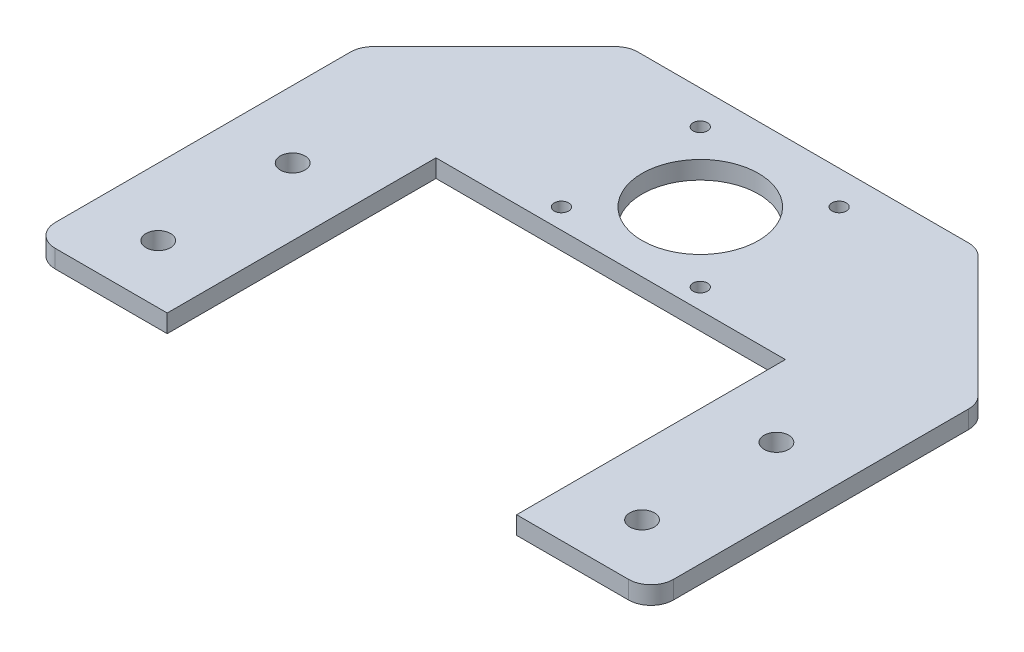
ISO-10303-21;
HEADER;
FILE_DESCRIPTION(('STEP AP214'),'2;1');
FILE_NAME('part.step','',(''),(''),'','','');
FILE_SCHEMA(('AUTOMOTIVE_DESIGN { 1 0 10303 214 1 1 1 1 }'));
ENDSEC;
DATA;
#1=APPLICATION_CONTEXT('core data for automotive mechanical design processes');
#2=APPLICATION_PROTOCOL_DEFINITION('international standard','automotive_design',2000,#1);
#3=PRODUCT_CONTEXT('',#1,'mechanical');
#4=PRODUCT('Part','Part','',(#3));
#5=PRODUCT_RELATED_PRODUCT_CATEGORY('part','',(#4));
#6=PRODUCT_DEFINITION_FORMATION('','',#4);
#7=PRODUCT_DEFINITION_CONTEXT('part definition',#1,'design');
#8=PRODUCT_DEFINITION('design','',#6,#7);
#9=PRODUCT_DEFINITION_SHAPE('','',#8);
#10=(LENGTH_UNIT() NAMED_UNIT(*) SI_UNIT(.MILLI.,.METRE.));
#11=(NAMED_UNIT(*) PLANE_ANGLE_UNIT() SI_UNIT($,.RADIAN.));
#12=(NAMED_UNIT(*) SI_UNIT($,.STERADIAN.) SOLID_ANGLE_UNIT());
#13=UNCERTAINTY_MEASURE_WITH_UNIT(LENGTH_MEASURE(1.E-05),#10,'distance_accuracy_value','');
#14=(GEOMETRIC_REPRESENTATION_CONTEXT(3) GLOBAL_UNCERTAINTY_ASSIGNED_CONTEXT((#13)) GLOBAL_UNIT_ASSIGNED_CONTEXT((#10,
#11,#12)) REPRESENTATION_CONTEXT('',''));
#15=CARTESIAN_POINT('',(0.,0.,0.));
#16=DIRECTION('',(0.,0.,1.));
#17=DIRECTION('',(1.,0.,0.));
#18=AXIS2_PLACEMENT_3D('',#15,#16,#17);
#19=CARTESIAN_POINT('',(0.,4.,0.));
#20=DIRECTION('',(0.,-1.,0.));
#21=DIRECTION('',(0.,0.,-1.));
#22=AXIS2_PLACEMENT_3D('',#19,#20,#21);
#23=PLANE('',#22);
#24=CARTESIAN_POINT('',(-54.,4.,47.));
#25=DIRECTION('',(0.,1.,0.));
#26=DIRECTION('',(0.,0.,1.));
#27=AXIS2_PLACEMENT_3D('',#24,#25,#26);
#28=CIRCLE('',#27,2.75);
#29=CARTESIAN_POINT('',(-54.,4.,49.75));
#30=VERTEX_POINT('',#29);
#31=EDGE_CURVE('E269',#30,#30,#28,.T.);
#32=ORIENTED_EDGE('',*,*,#31,.F.);
#33=EDGE_LOOP('',(#32));
#34=FACE_BOUND('',#33,.T.);
#35=CARTESIAN_POINT('',(-54.,4.,17.));
#36=DIRECTION('',(0.,1.,0.));
#37=DIRECTION('',(0.,0.,1.));
#38=AXIS2_PLACEMENT_3D('',#35,#36,#37);
#39=CIRCLE('',#38,2.75);
#40=CARTESIAN_POINT('',(-54.,4.,19.75));
#41=VERTEX_POINT('',#40);
#42=EDGE_CURVE('E259',#41,#41,#39,.T.);
#43=ORIENTED_EDGE('',*,*,#42,.F.);
#44=EDGE_LOOP('',(#43));
#45=FACE_BOUND('',#44,.T.);
#46=CARTESIAN_POINT('',(54.,4.,17.));
#47=DIRECTION('',(0.,1.,0.));
#48=DIRECTION('',(0.,0.,1.));
#49=AXIS2_PLACEMENT_3D('',#46,#47,#48);
#50=CIRCLE('',#49,2.75);
#51=CARTESIAN_POINT('',(54.,4.,19.75));
#52=VERTEX_POINT('',#51);
#53=EDGE_CURVE('E256',#52,#52,#50,.T.);
#54=ORIENTED_EDGE('',*,*,#53,.F.);
#55=EDGE_LOOP('',(#54));
#56=FACE_BOUND('',#55,.T.);
#57=CARTESIAN_POINT('',(54.,4.,47.));
#58=DIRECTION('',(0.,1.,0.));
#59=DIRECTION('',(0.,0.,1.));
#60=AXIS2_PLACEMENT_3D('',#57,#58,#59);
#61=CIRCLE('',#60,2.75);
#62=CARTESIAN_POINT('',(54.,4.,49.75));
#63=VERTEX_POINT('',#62);
#64=EDGE_CURVE('E255',#63,#63,#61,.T.);
#65=ORIENTED_EDGE('',*,*,#64,.F.);
#66=EDGE_LOOP('',(#65));
#67=FACE_BOUND('',#66,.T.);
#68=CARTESIAN_POINT('',(15.5,4.,-4.5));
#69=DIRECTION('',(0.,1.,0.));
#70=DIRECTION('',(0.,0.,1.));
#71=AXIS2_PLACEMENT_3D('',#68,#69,#70);
#72=CIRCLE('',#71,1.6);
#73=CARTESIAN_POINT('',(15.5,4.,-2.9));
#74=VERTEX_POINT('',#73);
#75=EDGE_CURVE('E198',#74,#74,#72,.T.);
#76=ORIENTED_EDGE('',*,*,#75,.F.);
#77=EDGE_LOOP('',(#76));
#78=FACE_BOUND('',#77,.T.);
#79=CARTESIAN_POINT('',(15.5,4.,-35.5));
#80=DIRECTION('',(0.,1.,0.));
#81=DIRECTION('',(0.,0.,1.));
#82=AXIS2_PLACEMENT_3D('',#79,#80,#81);
#83=CIRCLE('',#82,1.6);
#84=CARTESIAN_POINT('',(15.5,4.,-33.9));
#85=VERTEX_POINT('',#84);
#86=EDGE_CURVE('E194',#85,#85,#83,.T.);
#87=ORIENTED_EDGE('',*,*,#86,.F.);
#88=EDGE_LOOP('',(#87));
#89=FACE_BOUND('',#88,.T.);
#90=DIRECTION('',(0.,0.,1.));
#91=VECTOR('',#90,1.);
#92=CARTESIAN_POINT('',(-69.,4.,60.));
#93=LINE('',#92,#91);
#94=CARTESIAN_POINT('',(-69.,4.,-10.9289321881346));
#95=VERTEX_POINT('',#94);
#96=CARTESIAN_POINT('',(-69.,4.,55.));
#97=VERTEX_POINT('',#96);
#98=EDGE_CURVE('E301',#95,#97,#93,.T.);
#99=ORIENTED_EDGE('',*,*,#98,.T.);
#100=CARTESIAN_POINT('',(-64.,4.,55.));
#101=DIRECTION('',(0.,-1.,0.));
#102=DIRECTION('',(0.,0.,-1.));
#103=AXIS2_PLACEMENT_3D('',#100,#101,#102);
#104=CIRCLE('',#103,5.);
#105=CARTESIAN_POINT('',(-64.,4.,60.));
#106=VERTEX_POINT('',#105);
#107=EDGE_CURVE('E153',#97,#106,#104,.F.);
#108=ORIENTED_EDGE('',*,*,#107,.T.);
#109=DIRECTION('',(1.,0.,0.));
#110=VECTOR('',#109,1.);
#111=CARTESIAN_POINT('',(-39.,4.,60.));
#112=LINE('',#111,#110);
#113=CARTESIAN_POINT('',(-39.,4.,60.));
#114=VERTEX_POINT('',#113);
#115=EDGE_CURVE('E146',#106,#114,#112,.T.);
#116=ORIENTED_EDGE('',*,*,#115,.T.);
#117=DIRECTION('',(0.,0.,-1.));
#118=VECTOR('',#117,1.);
#119=CARTESIAN_POINT('',(-39.,4.,0.));
#120=LINE('',#119,#118);
#121=CARTESIAN_POINT('',(-39.,4.,0.));
#122=VERTEX_POINT('',#121);
#123=EDGE_CURVE('E150',#114,#122,#120,.T.);
#124=ORIENTED_EDGE('',*,*,#123,.T.);
#125=DIRECTION('',(1.,0.,0.));
#126=VECTOR('',#125,1.);
#127=CARTESIAN_POINT('',(39.,4.,0.));
#128=LINE('',#127,#126);
#129=CARTESIAN_POINT('',(39.,4.,0.));
#130=VERTEX_POINT('',#129);
#131=EDGE_CURVE('E167',#122,#130,#128,.T.);
#132=ORIENTED_EDGE('',*,*,#131,.T.);
#133=DIRECTION('',(0.,0.,1.));
#134=VECTOR('',#133,1.);
#135=CARTESIAN_POINT('',(39.,4.,60.));
#136=LINE('',#135,#134);
#137=CARTESIAN_POINT('',(39.,4.,60.));
#138=VERTEX_POINT('',#137);
#139=EDGE_CURVE('E291',#130,#138,#136,.T.);
#140=ORIENTED_EDGE('',*,*,#139,.T.);
#141=DIRECTION('',(1.,0.,0.));
#142=VECTOR('',#141,1.);
#143=CARTESIAN_POINT('',(69.,4.,60.));
#144=LINE('',#143,#142);
#145=CARTESIAN_POINT('',(64.,4.,60.));
#146=VERTEX_POINT('',#145);
#147=EDGE_CURVE('E293',#138,#146,#144,.T.);
#148=ORIENTED_EDGE('',*,*,#147,.T.);
#149=CARTESIAN_POINT('',(64.,4.,55.));
#150=DIRECTION('',(0.,-1.,0.));
#151=DIRECTION('',(0.,0.,-1.));
#152=AXIS2_PLACEMENT_3D('',#149,#150,#151);
#153=CIRCLE('',#152,5.);
#154=CARTESIAN_POINT('',(69.,4.,55.));
#155=VERTEX_POINT('',#154);
#156=EDGE_CURVE('E226',#146,#155,#153,.F.);
#157=ORIENTED_EDGE('',*,*,#156,.T.);
#158=DIRECTION('',(0.,0.,-1.));
#159=VECTOR('',#158,1.);
#160=CARTESIAN_POINT('',(69.,4.,-43.));
#161=LINE('',#160,#159);
#162=CARTESIAN_POINT('',(69.,4.,-10.9289321881344));
#163=VERTEX_POINT('',#162);
#164=EDGE_CURVE('E296',#155,#163,#161,.T.);
#165=ORIENTED_EDGE('',*,*,#164,.T.);
#166=CARTESIAN_POINT('',(64.,4.,-10.9289321881344));
#167=DIRECTION('',(0.,-1.,0.));
#168=DIRECTION('',(0.,0.,-1.));
#169=AXIS2_PLACEMENT_3D('',#166,#167,#168);
#170=CIRCLE('',#169,5.);
#171=CARTESIAN_POINT('',(67.5355339059328,4.,-14.4644660940671));
#172=VERTEX_POINT('',#171);
#173=EDGE_CURVE('E57',#163,#172,#170,.F.);
#174=ORIENTED_EDGE('',*,*,#173,.T.);
#175=DIRECTION('',(0.707106781186546,0.,0.707106781186549));
#176=VECTOR('',#175,1.);
#177=CARTESIAN_POINT('',(39.,4.,-43.));
#178=LINE('',#177,#176);
#179=CARTESIAN_POINT('',(40.4644660940672,4.,-41.5355339059327));
#180=VERTEX_POINT('',#179);
#181=EDGE_CURVE('E184',#172,#180,#178,.F.);
#182=ORIENTED_EDGE('',*,*,#181,.T.);
#183=CARTESIAN_POINT('',(36.9289321881345,4.,-38.));
#184=DIRECTION('',(0.,-1.,0.));
#185=DIRECTION('',(0.,0.,-1.));
#186=AXIS2_PLACEMENT_3D('',#183,#184,#185);
#187=CIRCLE('',#186,5.);
#188=CARTESIAN_POINT('',(36.9289321881345,4.,-43.));
#189=VERTEX_POINT('',#188);
#190=EDGE_CURVE('E228',#180,#189,#187,.F.);
#191=ORIENTED_EDGE('',*,*,#190,.T.);
#192=DIRECTION('',(-1.,0.,0.));
#193=VECTOR('',#192,1.);
#194=CARTESIAN_POINT('',(-69.,4.,-43.));
#195=LINE('',#194,#193);
#196=CARTESIAN_POINT('',(-36.9289321881344,4.,-43.));
#197=VERTEX_POINT('',#196);
#198=EDGE_CURVE('E298',#189,#197,#195,.T.);
#199=ORIENTED_EDGE('',*,*,#198,.T.);
#200=CARTESIAN_POINT('',(-36.9289321881344,4.,-38.));
#201=DIRECTION('',(0.,-1.,0.));
#202=DIRECTION('',(0.,0.,-1.));
#203=AXIS2_PLACEMENT_3D('',#200,#201,#202);
#204=CIRCLE('',#203,5.);
#205=CARTESIAN_POINT('',(-40.4644660940671,4.,-41.5355339059328));
#206=VERTEX_POINT('',#205);
#207=EDGE_CURVE('E230',#197,#206,#204,.F.);
#208=ORIENTED_EDGE('',*,*,#207,.T.);
#209=DIRECTION('',(0.707106781186549,0.,-0.707106781186546));
#210=VECTOR('',#209,1.);
#211=CARTESIAN_POINT('',(-69.,4.,-13.));
#212=LINE('',#211,#210);
#213=CARTESIAN_POINT('',(-67.5355339059327,4.,-14.4644660940673));
#214=VERTEX_POINT('',#213);
#215=EDGE_CURVE('E186',#206,#214,#212,.F.);
#216=ORIENTED_EDGE('',*,*,#215,.T.);
#217=CARTESIAN_POINT('',(-64.,4.,-10.9289321881346));
#218=DIRECTION('',(0.,-1.,0.));
#219=DIRECTION('',(0.,0.,-1.));
#220=AXIS2_PLACEMENT_3D('',#217,#218,#219);
#221=CIRCLE('',#220,5.);
#222=EDGE_CURVE('E232',#214,#95,#221,.F.);
#223=ORIENTED_EDGE('',*,*,#222,.T.);
#224=EDGE_LOOP('',(#99,#108,#116,#124,#132,#140,#148,#157,#165,#174,#182,#191,#199,#208,#216,#223));
#225=FACE_BOUND('',#224,.T.);
#226=CARTESIAN_POINT('',(0.,4.,-20.));
#227=DIRECTION('',(0.,1.,0.));
#228=DIRECTION('',(0.,0.,1.));
#229=AXIS2_PLACEMENT_3D('',#226,#227,#228);
#230=CIRCLE('',#229,13.);
#231=CARTESIAN_POINT('',(0.,4.,-7.));
#232=VERTEX_POINT('',#231);
#233=EDGE_CURVE('E285',#232,#232,#230,.T.);
#234=ORIENTED_EDGE('',*,*,#233,.F.);
#235=EDGE_LOOP('',(#234));
#236=FACE_BOUND('',#235,.T.);
#237=CARTESIAN_POINT('',(-15.5,4.,-4.5));
#238=DIRECTION('',(0.,1.,0.));
#239=DIRECTION('',(0.,0.,1.));
#240=AXIS2_PLACEMENT_3D('',#237,#238,#239);
#241=CIRCLE('',#240,1.6);
#242=CARTESIAN_POINT('',(-15.5,4.,-2.9));
#243=VERTEX_POINT('',#242);
#244=EDGE_CURVE('E202',#243,#243,#241,.T.);
#245=ORIENTED_EDGE('',*,*,#244,.F.);
#246=EDGE_LOOP('',(#245));
#247=FACE_BOUND('',#246,.T.);
#248=CARTESIAN_POINT('',(-15.5,4.,-35.5));
#249=DIRECTION('',(0.,1.,0.));
#250=DIRECTION('',(0.,0.,1.));
#251=AXIS2_PLACEMENT_3D('',#248,#249,#250);
#252=CIRCLE('',#251,1.6);
#253=CARTESIAN_POINT('',(-15.5,4.,-33.9));
#254=VERTEX_POINT('',#253);
#255=EDGE_CURVE('E206',#254,#254,#252,.T.);
#256=ORIENTED_EDGE('',*,*,#255,.F.);
#257=EDGE_LOOP('',(#256));
#258=FACE_BOUND('',#257,.T.);
#259=ADVANCED_FACE('F33',(#34,#45,#56,#67,#78,#89,#225,#236,#247,#258),#23,.F.);
#260=CARTESIAN_POINT('',(0.,0.,0.));
#261=DIRECTION('',(0.,-1.,0.));
#262=DIRECTION('',(0.,0.,-1.));
#263=AXIS2_PLACEMENT_3D('',#260,#261,#262);
#264=PLANE('',#263);
#265=CARTESIAN_POINT('',(-54.,0.,47.));
#266=DIRECTION('',(0.,-1.,0.));
#267=DIRECTION('',(0.,0.,-1.));
#268=AXIS2_PLACEMENT_3D('',#265,#266,#267);
#269=CIRCLE('',#268,2.75);
#270=CARTESIAN_POINT('',(-54.,0.,44.25));
#271=VERTEX_POINT('',#270);
#272=EDGE_CURVE('E37',#271,#271,#269,.T.);
#273=ORIENTED_EDGE('',*,*,#272,.F.);
#274=EDGE_LOOP('',(#273));
#275=FACE_BOUND('',#274,.T.);
#276=CARTESIAN_POINT('',(-54.,0.,17.));
#277=DIRECTION('',(0.,-1.,0.));
#278=DIRECTION('',(0.,0.,-1.));
#279=AXIS2_PLACEMENT_3D('',#276,#277,#278);
#280=CIRCLE('',#279,2.75);
#281=CARTESIAN_POINT('',(-54.,0.,14.25));
#282=VERTEX_POINT('',#281);
#283=EDGE_CURVE('E257',#282,#282,#280,.T.);
#284=ORIENTED_EDGE('',*,*,#283,.F.);
#285=EDGE_LOOP('',(#284));
#286=FACE_BOUND('',#285,.T.);
#287=CARTESIAN_POINT('',(54.,0.,17.));
#288=DIRECTION('',(0.,-1.,0.));
#289=DIRECTION('',(0.,0.,-1.));
#290=AXIS2_PLACEMENT_3D('',#287,#288,#289);
#291=CIRCLE('',#290,2.75);
#292=CARTESIAN_POINT('',(54.,0.,14.25));
#293=VERTEX_POINT('',#292);
#294=EDGE_CURVE('E253',#293,#293,#291,.T.);
#295=ORIENTED_EDGE('',*,*,#294,.F.);
#296=EDGE_LOOP('',(#295));
#297=FACE_BOUND('',#296,.T.);
#298=CARTESIAN_POINT('',(54.,0.,47.));
#299=DIRECTION('',(0.,-1.,0.));
#300=DIRECTION('',(0.,0.,-1.));
#301=AXIS2_PLACEMENT_3D('',#298,#299,#300);
#302=CIRCLE('',#301,2.75);
#303=CARTESIAN_POINT('',(54.,0.,44.25));
#304=VERTEX_POINT('',#303);
#305=EDGE_CURVE('E274',#304,#304,#302,.T.);
#306=ORIENTED_EDGE('',*,*,#305,.F.);
#307=EDGE_LOOP('',(#306));
#308=FACE_BOUND('',#307,.T.);
#309=CARTESIAN_POINT('',(-15.5,0.,-35.5));
#310=DIRECTION('',(0.,-1.,0.));
#311=DIRECTION('',(0.,0.,-1.));
#312=AXIS2_PLACEMENT_3D('',#309,#310,#311);
#313=CIRCLE('',#312,1.6);
#314=CARTESIAN_POINT('',(-15.5,0.,-37.1));
#315=VERTEX_POINT('',#314);
#316=EDGE_CURVE('E203',#315,#315,#313,.T.);
#317=ORIENTED_EDGE('',*,*,#316,.F.);
#318=EDGE_LOOP('',(#317));
#319=FACE_BOUND('',#318,.T.);
#320=CARTESIAN_POINT('',(-15.5,0.,-4.5));
#321=DIRECTION('',(0.,-1.,0.));
#322=DIRECTION('',(0.,0.,-1.));
#323=AXIS2_PLACEMENT_3D('',#320,#321,#322);
#324=CIRCLE('',#323,1.6);
#325=CARTESIAN_POINT('',(-15.5,0.,-6.1));
#326=VERTEX_POINT('',#325);
#327=EDGE_CURVE('E199',#326,#326,#324,.T.);
#328=ORIENTED_EDGE('',*,*,#327,.F.);
#329=EDGE_LOOP('',(#328));
#330=FACE_BOUND('',#329,.T.);
#331=CARTESIAN_POINT('',(15.5,0.,-4.5));
#332=DIRECTION('',(0.,-1.,0.));
#333=DIRECTION('',(0.,0.,-1.));
#334=AXIS2_PLACEMENT_3D('',#331,#332,#333);
#335=CIRCLE('',#334,1.6);
#336=CARTESIAN_POINT('',(15.5,0.,-6.1));
#337=VERTEX_POINT('',#336);
#338=EDGE_CURVE('E195',#337,#337,#335,.T.);
#339=ORIENTED_EDGE('',*,*,#338,.F.);
#340=EDGE_LOOP('',(#339));
#341=FACE_BOUND('',#340,.T.);
#342=CARTESIAN_POINT('',(15.5,0.,-35.5));
#343=DIRECTION('',(0.,-1.,0.));
#344=DIRECTION('',(0.,0.,-1.));
#345=AXIS2_PLACEMENT_3D('',#342,#343,#344);
#346=CIRCLE('',#345,1.6);
#347=CARTESIAN_POINT('',(15.5,0.,-37.1));
#348=VERTEX_POINT('',#347);
#349=EDGE_CURVE('E190',#348,#348,#346,.T.);
#350=ORIENTED_EDGE('',*,*,#349,.F.);
#351=EDGE_LOOP('',(#350));
#352=FACE_BOUND('',#351,.T.);
#353=DIRECTION('',(1.,0.,0.));
#354=VECTOR('',#353,1.);
#355=CARTESIAN_POINT('',(-39.,0.,60.));
#356=LINE('',#355,#354);
#357=CARTESIAN_POINT('',(-64.,0.,60.));
#358=VERTEX_POINT('',#357);
#359=CARTESIAN_POINT('',(-39.,0.,60.));
#360=VERTEX_POINT('',#359);
#361=EDGE_CURVE('E171',#358,#360,#356,.T.);
#362=ORIENTED_EDGE('',*,*,#361,.F.);
#363=CARTESIAN_POINT('',(-64.,0.,55.));
#364=DIRECTION('',(0.,-1.,0.));
#365=DIRECTION('',(0.,0.,-1.));
#366=AXIS2_PLACEMENT_3D('',#363,#364,#365);
#367=CIRCLE('',#366,5.);
#368=CARTESIAN_POINT('',(-69.,0.,55.));
#369=VERTEX_POINT('',#368);
#370=EDGE_CURVE('E218',#358,#369,#367,.T.);
#371=ORIENTED_EDGE('',*,*,#370,.T.);
#372=DIRECTION('',(0.,0.,1.));
#373=VECTOR('',#372,1.);
#374=CARTESIAN_POINT('',(-69.,0.,60.));
#375=LINE('',#374,#373);
#376=CARTESIAN_POINT('',(-69.,0.,-10.9289321881346));
#377=VERTEX_POINT('',#376);
#378=EDGE_CURVE('E158',#377,#369,#375,.T.);
#379=ORIENTED_EDGE('',*,*,#378,.F.);
#380=CARTESIAN_POINT('',(-64.,0.,-10.9289321881346));
#381=DIRECTION('',(0.,-1.,0.));
#382=DIRECTION('',(0.,0.,-1.));
#383=AXIS2_PLACEMENT_3D('',#380,#381,#382);
#384=CIRCLE('',#383,5.);
#385=CARTESIAN_POINT('',(-67.5355339059327,0.,-14.4644660940673));
#386=VERTEX_POINT('',#385);
#387=EDGE_CURVE('E216',#377,#386,#384,.T.);
#388=ORIENTED_EDGE('',*,*,#387,.T.);
#389=DIRECTION('',(-0.707106781186549,0.,0.707106781186546));
#390=VECTOR('',#389,1.);
#391=CARTESIAN_POINT('',(-40.9999999999999,0.,-41.));
#392=LINE('',#391,#390);
#393=CARTESIAN_POINT('',(-40.4644660940671,0.,-41.5355339059327));
#394=VERTEX_POINT('',#393);
#395=EDGE_CURVE('E176',#386,#394,#392,.F.);
#396=ORIENTED_EDGE('',*,*,#395,.T.);
#397=CARTESIAN_POINT('',(-36.9289321881344,0.,-38.));
#398=DIRECTION('',(0.,-1.,0.));
#399=DIRECTION('',(0.,0.,-1.));
#400=AXIS2_PLACEMENT_3D('',#397,#398,#399);
#401=CIRCLE('',#400,5.);
#402=CARTESIAN_POINT('',(-36.9289321881344,0.,-43.));
#403=VERTEX_POINT('',#402);
#404=EDGE_CURVE('E214',#394,#403,#401,.T.);
#405=ORIENTED_EDGE('',*,*,#404,.T.);
#406=DIRECTION('',(-1.,0.,0.));
#407=VECTOR('',#406,1.);
#408=CARTESIAN_POINT('',(-69.,0.,-43.));
#409=LINE('',#408,#407);
#410=CARTESIAN_POINT('',(36.9289321881345,0.,-43.));
#411=VERTEX_POINT('',#410);
#412=EDGE_CURVE('E317',#411,#403,#409,.T.);
#413=ORIENTED_EDGE('',*,*,#412,.F.);
#414=CARTESIAN_POINT('',(36.9289321881345,0.,-38.));
#415=DIRECTION('',(0.,-1.,0.));
#416=DIRECTION('',(0.,0.,-1.));
#417=AXIS2_PLACEMENT_3D('',#414,#415,#416);
#418=CIRCLE('',#417,5.);
#419=CARTESIAN_POINT('',(40.4644660940673,0.,-41.5355339059327));
#420=VERTEX_POINT('',#419);
#421=EDGE_CURVE('E212',#411,#420,#418,.T.);
#422=ORIENTED_EDGE('',*,*,#421,.T.);
#423=DIRECTION('',(-0.707106781186546,0.,-0.707106781186549));
#424=VECTOR('',#423,1.);
#425=CARTESIAN_POINT('',(41.0000000000001,0.,-40.9999999999999));
#426=LINE('',#425,#424);
#427=CARTESIAN_POINT('',(67.5355339059328,0.,-14.4644660940671));
#428=VERTEX_POINT('',#427);
#429=EDGE_CURVE('E173',#420,#428,#426,.F.);
#430=ORIENTED_EDGE('',*,*,#429,.T.);
#431=CARTESIAN_POINT('',(64.,0.,-10.9289321881344));
#432=DIRECTION('',(0.,-1.,0.));
#433=DIRECTION('',(0.,0.,-1.));
#434=AXIS2_PLACEMENT_3D('',#431,#432,#433);
#435=CIRCLE('',#434,5.);
#436=CARTESIAN_POINT('',(69.,0.,-10.9289321881344));
#437=VERTEX_POINT('',#436);
#438=EDGE_CURVE('E208',#428,#437,#435,.T.);
#439=ORIENTED_EDGE('',*,*,#438,.T.);
#440=DIRECTION('',(0.,0.,-1.));
#441=VECTOR('',#440,1.);
#442=CARTESIAN_POINT('',(69.,0.,-43.));
#443=LINE('',#442,#441);
#444=CARTESIAN_POINT('',(69.,0.,55.));
#445=VERTEX_POINT('',#444);
#446=EDGE_CURVE('E314',#445,#437,#443,.T.);
#447=ORIENTED_EDGE('',*,*,#446,.F.);
#448=CARTESIAN_POINT('',(64.,0.,55.));
#449=DIRECTION('',(0.,-1.,0.));
#450=DIRECTION('',(0.,0.,-1.));
#451=AXIS2_PLACEMENT_3D('',#448,#449,#450);
#452=CIRCLE('',#451,5.);
#453=CARTESIAN_POINT('',(64.,0.,60.));
#454=VERTEX_POINT('',#453);
#455=EDGE_CURVE('E210',#445,#454,#452,.T.);
#456=ORIENTED_EDGE('',*,*,#455,.T.);
#457=DIRECTION('',(1.,0.,0.));
#458=VECTOR('',#457,1.);
#459=CARTESIAN_POINT('',(69.,0.,60.));
#460=LINE('',#459,#458);
#461=CARTESIAN_POINT('',(39.,0.,60.));
#462=VERTEX_POINT('',#461);
#463=EDGE_CURVE('E311',#462,#454,#460,.T.);
#464=ORIENTED_EDGE('',*,*,#463,.F.);
#465=DIRECTION('',(0.,0.,1.));
#466=VECTOR('',#465,1.);
#467=CARTESIAN_POINT('',(39.,0.,60.));
#468=LINE('',#467,#466);
#469=CARTESIAN_POINT('',(39.,0.,0.));
#470=VERTEX_POINT('',#469);
#471=EDGE_CURVE('E309',#470,#462,#468,.T.);
#472=ORIENTED_EDGE('',*,*,#471,.F.);
#473=DIRECTION('',(1.,0.,0.));
#474=VECTOR('',#473,1.);
#475=CARTESIAN_POINT('',(39.,0.,0.));
#476=LINE('',#475,#474);
#477=CARTESIAN_POINT('',(-39.,0.,0.));
#478=VERTEX_POINT('',#477);
#479=EDGE_CURVE('E307',#478,#470,#476,.T.);
#480=ORIENTED_EDGE('',*,*,#479,.F.);
#481=DIRECTION('',(0.,0.,-1.));
#482=VECTOR('',#481,1.);
#483=CARTESIAN_POINT('',(-39.,0.,0.));
#484=LINE('',#483,#482);
#485=EDGE_CURVE('E305',#360,#478,#484,.T.);
#486=ORIENTED_EDGE('',*,*,#485,.F.);
#487=EDGE_LOOP('',(#362,#371,#379,#388,#396,#405,#413,#422,#430,#439,#447,#456,#464,#472,#480,#486));
#488=FACE_BOUND('',#487,.T.);
#489=CARTESIAN_POINT('',(0.,0.,-20.));
#490=DIRECTION('',(0.,1.,0.));
#491=DIRECTION('',(0.,0.,1.));
#492=AXIS2_PLACEMENT_3D('',#489,#490,#491);
#493=CIRCLE('',#492,13.);
#494=CARTESIAN_POINT('',(0.,0.,-7.));
#495=VERTEX_POINT('',#494);
#496=EDGE_CURVE('E193',#495,#495,#493,.T.);
#497=ORIENTED_EDGE('',*,*,#496,.T.);
#498=EDGE_LOOP('',(#497));
#499=FACE_BOUND('',#498,.T.);
#500=ADVANCED_FACE('F334',(#275,#286,#297,#308,#319,#330,#341,#352,#488,#499),#264,.T.);
#501=CARTESIAN_POINT('',(-39.,4.,60.));
#502=DIRECTION('',(0.,0.,-1.));
#503=DIRECTION('',(-1.,0.,0.));
#504=AXIS2_PLACEMENT_3D('',#501,#502,#503);
#505=PLANE('',#504);
#506=ORIENTED_EDGE('',*,*,#115,.F.);
#507=DIRECTION('',(0.,-1.,0.));
#508=VECTOR('',#507,1.);
#509=CARTESIAN_POINT('',(-64.,4.,60.));
#510=LINE('',#509,#508);
#511=EDGE_CURVE('E189',#106,#358,#510,.T.);
#512=ORIENTED_EDGE('',*,*,#511,.T.);
#513=ORIENTED_EDGE('',*,*,#361,.T.);
#514=DIRECTION('',(0.,-1.,0.));
#515=VECTOR('',#514,1.);
#516=CARTESIAN_POINT('',(-39.,4.,60.));
#517=LINE('',#516,#515);
#518=EDGE_CURVE('E163',#114,#360,#517,.T.);
#519=ORIENTED_EDGE('',*,*,#518,.F.);
#520=EDGE_LOOP('',(#506,#512,#513,#519));
#521=FACE_BOUND('',#520,.T.);
#522=ADVANCED_FACE('F169',(#521),#505,.F.);
#523=CARTESIAN_POINT('',(-39.,4.,0.));
#524=DIRECTION('',(-1.,0.,0.));
#525=DIRECTION('',(0.,0.,1.));
#526=AXIS2_PLACEMENT_3D('',#523,#524,#525);
#527=PLANE('',#526);
#528=ORIENTED_EDGE('',*,*,#485,.T.);
#529=DIRECTION('',(0.,-1.,0.));
#530=VECTOR('',#529,1.);
#531=CARTESIAN_POINT('',(-39.,4.,0.));
#532=LINE('',#531,#530);
#533=EDGE_CURVE('E165',#122,#478,#532,.T.);
#534=ORIENTED_EDGE('',*,*,#533,.F.);
#535=ORIENTED_EDGE('',*,*,#123,.F.);
#536=ORIENTED_EDGE('',*,*,#518,.T.);
#537=EDGE_LOOP('',(#528,#534,#535,#536));
#538=FACE_BOUND('',#537,.T.);
#539=ADVANCED_FACE('F162',(#538),#527,.F.);
#540=CARTESIAN_POINT('',(39.,4.,0.));
#541=DIRECTION('',(0.,0.,-1.));
#542=DIRECTION('',(-1.,0.,0.));
#543=AXIS2_PLACEMENT_3D('',#540,#541,#542);
#544=PLANE('',#543);
#545=ORIENTED_EDGE('',*,*,#479,.T.);
#546=DIRECTION('',(0.,-1.,0.));
#547=VECTOR('',#546,1.);
#548=CARTESIAN_POINT('',(39.,4.,0.));
#549=LINE('',#548,#547);
#550=EDGE_CURVE('E178',#130,#470,#549,.T.);
#551=ORIENTED_EDGE('',*,*,#550,.F.);
#552=ORIENTED_EDGE('',*,*,#131,.F.);
#553=ORIENTED_EDGE('',*,*,#533,.T.);
#554=EDGE_LOOP('',(#545,#551,#552,#553));
#555=FACE_BOUND('',#554,.T.);
#556=ADVANCED_FACE('F382',(#555),#544,.F.);
#557=CARTESIAN_POINT('',(39.,4.,60.));
#558=DIRECTION('',(1.,0.,0.));
#559=DIRECTION('',(0.,0.,-1.));
#560=AXIS2_PLACEMENT_3D('',#557,#558,#559);
#561=PLANE('',#560);
#562=ORIENTED_EDGE('',*,*,#471,.T.);
#563=DIRECTION('',(0.,-1.,0.));
#564=VECTOR('',#563,1.);
#565=CARTESIAN_POINT('',(39.,4.,60.));
#566=LINE('',#565,#564);
#567=EDGE_CURVE('E303',#138,#462,#566,.T.);
#568=ORIENTED_EDGE('',*,*,#567,.F.);
#569=ORIENTED_EDGE('',*,*,#139,.F.);
#570=ORIENTED_EDGE('',*,*,#550,.T.);
#571=EDGE_LOOP('',(#562,#568,#569,#570));
#572=FACE_BOUND('',#571,.T.);
#573=ADVANCED_FACE('F328',(#572),#561,.F.);
#574=CARTESIAN_POINT('',(69.,4.,60.));
#575=DIRECTION('',(0.,0.,-1.));
#576=DIRECTION('',(-1.,0.,0.));
#577=AXIS2_PLACEMENT_3D('',#574,#575,#576);
#578=PLANE('',#577);
#579=ORIENTED_EDGE('',*,*,#463,.T.);
#580=DIRECTION('',(0.,-1.,0.));
#581=VECTOR('',#580,1.);
#582=CARTESIAN_POINT('',(64.,4.,60.));
#583=LINE('',#582,#581);
#584=EDGE_CURVE('E11',#454,#146,#583,.F.);
#585=ORIENTED_EDGE('',*,*,#584,.T.);
#586=ORIENTED_EDGE('',*,*,#147,.F.);
#587=ORIENTED_EDGE('',*,*,#567,.T.);
#588=EDGE_LOOP('',(#579,#585,#586,#587));
#589=FACE_BOUND('',#588,.T.);
#590=ADVANCED_FACE('F339',(#589),#578,.F.);
#591=CARTESIAN_POINT('',(69.,4.,-43.));
#592=DIRECTION('',(-1.,0.,0.));
#593=DIRECTION('',(0.,0.,1.));
#594=AXIS2_PLACEMENT_3D('',#591,#592,#593);
#595=PLANE('',#594);
#596=ORIENTED_EDGE('',*,*,#164,.F.);
#597=DIRECTION('',(0.,-1.,0.));
#598=VECTOR('',#597,1.);
#599=CARTESIAN_POINT('',(69.,4.,55.));
#600=LINE('',#599,#598);
#601=EDGE_CURVE('E42',#155,#445,#600,.T.);
#602=ORIENTED_EDGE('',*,*,#601,.T.);
#603=ORIENTED_EDGE('',*,*,#446,.T.);
#604=DIRECTION('',(0.,-1.,0.));
#605=VECTOR('',#604,1.);
#606=CARTESIAN_POINT('',(69.,4.,-10.9289321881344));
#607=LINE('',#606,#605);
#608=EDGE_CURVE('E248',#437,#163,#607,.F.);
#609=ORIENTED_EDGE('',*,*,#608,.T.);
#610=EDGE_LOOP('',(#596,#602,#603,#609));
#611=FACE_BOUND('',#610,.T.);
#612=ADVANCED_FACE('F347',(#611),#595,.F.);
#613=CARTESIAN_POINT('',(-69.,4.,-43.));
#614=DIRECTION('',(0.,0.,1.));
#615=DIRECTION('',(1.,0.,0.));
#616=AXIS2_PLACEMENT_3D('',#613,#614,#615);
#617=PLANE('',#616);
#618=ORIENTED_EDGE('',*,*,#412,.T.);
#619=DIRECTION('',(0.,-1.,0.));
#620=VECTOR('',#619,1.);
#621=CARTESIAN_POINT('',(-36.9289321881344,4.,-43.));
#622=LINE('',#621,#620);
#623=EDGE_CURVE('E242',#403,#197,#622,.F.);
#624=ORIENTED_EDGE('',*,*,#623,.T.);
#625=ORIENTED_EDGE('',*,*,#198,.F.);
#626=DIRECTION('',(0.,1.,0.));
#627=VECTOR('',#626,1.);
#628=CARTESIAN_POINT('',(36.9289321881345,0.,-43.));
#629=LINE('',#628,#627);
#630=EDGE_CURVE('E239',#189,#411,#629,.F.);
#631=ORIENTED_EDGE('',*,*,#630,.T.);
#632=EDGE_LOOP('',(#618,#624,#625,#631));
#633=FACE_BOUND('',#632,.T.);
#634=ADVANCED_FACE('F360',(#633),#617,.F.);
#635=CARTESIAN_POINT('',(-69.,4.,60.));
#636=DIRECTION('',(1.,0.,0.));
#637=DIRECTION('',(0.,0.,-1.));
#638=AXIS2_PLACEMENT_3D('',#635,#636,#637);
#639=PLANE('',#638);
#640=ORIENTED_EDGE('',*,*,#378,.T.);
#641=DIRECTION('',(0.,-1.,0.));
#642=VECTOR('',#641,1.);
#643=CARTESIAN_POINT('',(-69.,4.,55.));
#644=LINE('',#643,#642);
#645=EDGE_CURVE('E223',#369,#97,#644,.F.);
#646=ORIENTED_EDGE('',*,*,#645,.T.);
#647=ORIENTED_EDGE('',*,*,#98,.F.);
#648=DIRECTION('',(0.,1.,0.));
#649=VECTOR('',#648,1.);
#650=CARTESIAN_POINT('',(-69.,0.,-10.9289321881346));
#651=LINE('',#650,#649);
#652=EDGE_CURVE('E220',#95,#377,#651,.F.);
#653=ORIENTED_EDGE('',*,*,#652,.T.);
#654=EDGE_LOOP('',(#640,#646,#647,#653));
#655=FACE_BOUND('',#654,.T.);
#656=ADVANCED_FACE('F378',(#655),#639,.F.);
#657=CARTESIAN_POINT('',(0.,4.,-20.));
#658=DIRECTION('',(0.,-1.,0.));
#659=DIRECTION('',(0.,0.,-1.));
#660=AXIS2_PLACEMENT_3D('',#657,#658,#659);
#661=CYLINDRICAL_SURFACE('',#660,13.);
#662=ORIENTED_EDGE('',*,*,#233,.T.);
#663=EDGE_LOOP('',(#662));
#664=FACE_BOUND('',#663,.T.);
#665=ORIENTED_EDGE('',*,*,#496,.F.);
#666=EDGE_LOOP('',(#665));
#667=FACE_BOUND('',#666,.T.);
#668=ADVANCED_FACE('F402',(#664,#667),#661,.F.);
#669=CARTESIAN_POINT('',(-69.,4.,-13.));
#670=DIRECTION('',(0.707106781186546,0.,0.707106781186549));
#671=DIRECTION('',(0.,-1.,0.));
#672=AXIS2_PLACEMENT_3D('',#669,#670,#671);
#673=PLANE('',#672);
#674=ORIENTED_EDGE('',*,*,#395,.F.);
#675=DIRECTION('',(0.,-1.,0.));
#676=VECTOR('',#675,1.);
#677=CARTESIAN_POINT('',(-67.5355339059327,4.,-14.4644660940673));
#678=LINE('',#677,#676);
#679=EDGE_CURVE('E237',#386,#214,#678,.F.);
#680=ORIENTED_EDGE('',*,*,#679,.T.);
#681=ORIENTED_EDGE('',*,*,#215,.F.);
#682=DIRECTION('',(0.,1.,0.));
#683=VECTOR('',#682,1.);
#684=CARTESIAN_POINT('',(-40.4644660940672,0.,-41.5355339059328));
#685=LINE('',#684,#683);
#686=EDGE_CURVE('E235',#206,#394,#685,.F.);
#687=ORIENTED_EDGE('',*,*,#686,.T.);
#688=EDGE_LOOP('',(#674,#680,#681,#687));
#689=FACE_BOUND('',#688,.T.);
#690=ADVANCED_FACE('F368',(#689),#673,.F.);
#691=CARTESIAN_POINT('',(39.,4.,-43.));
#692=DIRECTION('',(-0.707106781186549,0.,0.707106781186546));
#693=DIRECTION('',(0.,-1.,0.));
#694=AXIS2_PLACEMENT_3D('',#691,#692,#693);
#695=PLANE('',#694);
#696=ORIENTED_EDGE('',*,*,#429,.F.);
#697=DIRECTION('',(0.,-1.,0.));
#698=VECTOR('',#697,1.);
#699=CARTESIAN_POINT('',(40.4644660940672,4.,-41.5355339059327));
#700=LINE('',#699,#698);
#701=EDGE_CURVE('E50',#420,#180,#700,.F.);
#702=ORIENTED_EDGE('',*,*,#701,.T.);
#703=ORIENTED_EDGE('',*,*,#181,.F.);
#704=DIRECTION('',(0.,1.,0.));
#705=VECTOR('',#704,1.);
#706=CARTESIAN_POINT('',(67.5355339059327,0.,-14.4644660940672));
#707=LINE('',#706,#705);
#708=EDGE_CURVE('E245',#172,#428,#707,.F.);
#709=ORIENTED_EDGE('',*,*,#708,.T.);
#710=EDGE_LOOP('',(#696,#702,#703,#709));
#711=FACE_BOUND('',#710,.T.);
#712=ADVANCED_FACE('F352',(#711),#695,.F.);
#713=CARTESIAN_POINT('',(15.5,4.,-35.5));
#714=DIRECTION('',(0.,1.,0.));
#715=DIRECTION('',(0.,0.,1.));
#716=AXIS2_PLACEMENT_3D('',#713,#714,#715);
#717=CYLINDRICAL_SURFACE('',#716,1.6);
#718=ORIENTED_EDGE('',*,*,#349,.T.);
#719=EDGE_LOOP('',(#718));
#720=FACE_BOUND('',#719,.T.);
#721=ORIENTED_EDGE('',*,*,#86,.T.);
#722=EDGE_LOOP('',(#721));
#723=FACE_BOUND('',#722,.T.);
#724=ADVANCED_FACE('F448',(#720,#723),#717,.F.);
#725=CARTESIAN_POINT('',(15.5,4.,-4.5));
#726=DIRECTION('',(0.,1.,0.));
#727=DIRECTION('',(0.,0.,1.));
#728=AXIS2_PLACEMENT_3D('',#725,#726,#727);
#729=CYLINDRICAL_SURFACE('',#728,1.6);
#730=ORIENTED_EDGE('',*,*,#338,.T.);
#731=EDGE_LOOP('',(#730));
#732=FACE_BOUND('',#731,.T.);
#733=ORIENTED_EDGE('',*,*,#75,.T.);
#734=EDGE_LOOP('',(#733));
#735=FACE_BOUND('',#734,.T.);
#736=ADVANCED_FACE('F455',(#732,#735),#729,.F.);
#737=CARTESIAN_POINT('',(-15.5,4.,-4.5));
#738=DIRECTION('',(0.,1.,0.));
#739=DIRECTION('',(0.,0.,1.));
#740=AXIS2_PLACEMENT_3D('',#737,#738,#739);
#741=CYLINDRICAL_SURFACE('',#740,1.6);
#742=ORIENTED_EDGE('',*,*,#327,.T.);
#743=EDGE_LOOP('',(#742));
#744=FACE_BOUND('',#743,.T.);
#745=ORIENTED_EDGE('',*,*,#244,.T.);
#746=EDGE_LOOP('',(#745));
#747=FACE_BOUND('',#746,.T.);
#748=ADVANCED_FACE('F462',(#744,#747),#741,.F.);
#749=CARTESIAN_POINT('',(-15.5,4.,-35.5));
#750=DIRECTION('',(0.,1.,0.));
#751=DIRECTION('',(0.,0.,1.));
#752=AXIS2_PLACEMENT_3D('',#749,#750,#751);
#753=CYLINDRICAL_SURFACE('',#752,1.6);
#754=ORIENTED_EDGE('',*,*,#316,.T.);
#755=EDGE_LOOP('',(#754));
#756=FACE_BOUND('',#755,.T.);
#757=ORIENTED_EDGE('',*,*,#255,.T.);
#758=EDGE_LOOP('',(#757));
#759=FACE_BOUND('',#758,.T.);
#760=ADVANCED_FACE('F470',(#756,#759),#753,.F.);
#761=CARTESIAN_POINT('',(-64.,4.,55.));
#762=DIRECTION('',(0.,-1.,0.));
#763=DIRECTION('',(0.,0.,-1.));
#764=AXIS2_PLACEMENT_3D('',#761,#762,#763);
#765=CYLINDRICAL_SURFACE('',#764,5.);
#766=ORIENTED_EDGE('',*,*,#107,.F.);
#767=ORIENTED_EDGE('',*,*,#645,.F.);
#768=ORIENTED_EDGE('',*,*,#370,.F.);
#769=ORIENTED_EDGE('',*,*,#511,.F.);
#770=EDGE_LOOP('',(#766,#767,#768,#769));
#771=FACE_BOUND('',#770,.T.);
#772=ADVANCED_FACE('F381',(#771),#765,.T.);
#773=CARTESIAN_POINT('',(-64.,4.,-10.9289321881346));
#774=DIRECTION('',(0.,-1.,0.));
#775=DIRECTION('',(0.,0.,-1.));
#776=AXIS2_PLACEMENT_3D('',#773,#774,#775);
#777=CYLINDRICAL_SURFACE('',#776,5.);
#778=ORIENTED_EDGE('',*,*,#222,.F.);
#779=ORIENTED_EDGE('',*,*,#679,.F.);
#780=ORIENTED_EDGE('',*,*,#387,.F.);
#781=ORIENTED_EDGE('',*,*,#652,.F.);
#782=EDGE_LOOP('',(#778,#779,#780,#781));
#783=FACE_BOUND('',#782,.T.);
#784=ADVANCED_FACE('F374',(#783),#777,.T.);
#785=CARTESIAN_POINT('',(-36.9289321881344,4.,-38.));
#786=DIRECTION('',(0.,1.,0.));
#787=DIRECTION('',(0.,0.,1.));
#788=AXIS2_PLACEMENT_3D('',#785,#786,#787);
#789=CYLINDRICAL_SURFACE('',#788,5.);
#790=ORIENTED_EDGE('',*,*,#404,.F.);
#791=ORIENTED_EDGE('',*,*,#686,.F.);
#792=ORIENTED_EDGE('',*,*,#207,.F.);
#793=ORIENTED_EDGE('',*,*,#623,.F.);
#794=EDGE_LOOP('',(#790,#791,#792,#793));
#795=FACE_BOUND('',#794,.T.);
#796=ADVANCED_FACE('F371',(#795),#789,.T.);
#797=CARTESIAN_POINT('',(36.9289321881345,4.,-38.));
#798=DIRECTION('',(0.,-1.,0.));
#799=DIRECTION('',(0.,0.,-1.));
#800=AXIS2_PLACEMENT_3D('',#797,#798,#799);
#801=CYLINDRICAL_SURFACE('',#800,5.);
#802=ORIENTED_EDGE('',*,*,#190,.F.);
#803=ORIENTED_EDGE('',*,*,#701,.F.);
#804=ORIENTED_EDGE('',*,*,#421,.F.);
#805=ORIENTED_EDGE('',*,*,#630,.F.);
#806=EDGE_LOOP('',(#802,#803,#804,#805));
#807=FACE_BOUND('',#806,.T.);
#808=ADVANCED_FACE('F357',(#807),#801,.T.);
#809=CARTESIAN_POINT('',(64.,4.,55.));
#810=DIRECTION('',(0.,-1.,0.));
#811=DIRECTION('',(0.,0.,-1.));
#812=AXIS2_PLACEMENT_3D('',#809,#810,#811);
#813=CYLINDRICAL_SURFACE('',#812,5.);
#814=ORIENTED_EDGE('',*,*,#156,.F.);
#815=ORIENTED_EDGE('',*,*,#584,.F.);
#816=ORIENTED_EDGE('',*,*,#455,.F.);
#817=ORIENTED_EDGE('',*,*,#601,.F.);
#818=EDGE_LOOP('',(#814,#815,#816,#817));
#819=FACE_BOUND('',#818,.T.);
#820=ADVANCED_FACE('F343',(#819),#813,.T.);
#821=CARTESIAN_POINT('',(64.,4.,-10.9289321881344));
#822=DIRECTION('',(0.,1.,0.));
#823=DIRECTION('',(0.,0.,1.));
#824=AXIS2_PLACEMENT_3D('',#821,#822,#823);
#825=CYLINDRICAL_SURFACE('',#824,5.);
#826=ORIENTED_EDGE('',*,*,#438,.F.);
#827=ORIENTED_EDGE('',*,*,#708,.F.);
#828=ORIENTED_EDGE('',*,*,#173,.F.);
#829=ORIENTED_EDGE('',*,*,#608,.F.);
#830=EDGE_LOOP('',(#826,#827,#828,#829));
#831=FACE_BOUND('',#830,.T.);
#832=ADVANCED_FACE('F35',(#831),#825,.T.);
#833=CARTESIAN_POINT('',(54.,4.,47.));
#834=DIRECTION('',(0.,1.,0.));
#835=DIRECTION('',(0.,0.,1.));
#836=AXIS2_PLACEMENT_3D('',#833,#834,#835);
#837=CYLINDRICAL_SURFACE('',#836,2.75);
#838=ORIENTED_EDGE('',*,*,#305,.T.);
#839=EDGE_LOOP('',(#838));
#840=FACE_BOUND('',#839,.T.);
#841=ORIENTED_EDGE('',*,*,#64,.T.);
#842=EDGE_LOOP('',(#841));
#843=FACE_BOUND('',#842,.T.);
#844=ADVANCED_FACE('F513',(#840,#843),#837,.F.);
#845=CARTESIAN_POINT('',(54.,4.,17.));
#846=DIRECTION('',(0.,1.,0.));
#847=DIRECTION('',(0.,0.,1.));
#848=AXIS2_PLACEMENT_3D('',#845,#846,#847);
#849=CYLINDRICAL_SURFACE('',#848,2.75);
#850=ORIENTED_EDGE('',*,*,#294,.T.);
#851=EDGE_LOOP('',(#850));
#852=FACE_BOUND('',#851,.T.);
#853=ORIENTED_EDGE('',*,*,#53,.T.);
#854=EDGE_LOOP('',(#853));
#855=FACE_BOUND('',#854,.T.);
#856=ADVANCED_FACE('F519',(#852,#855),#849,.F.);
#857=CARTESIAN_POINT('',(-54.,4.,17.));
#858=DIRECTION('',(0.,1.,0.));
#859=DIRECTION('',(0.,0.,1.));
#860=AXIS2_PLACEMENT_3D('',#857,#858,#859);
#861=CYLINDRICAL_SURFACE('',#860,2.75);
#862=ORIENTED_EDGE('',*,*,#283,.T.);
#863=EDGE_LOOP('',(#862));
#864=FACE_BOUND('',#863,.T.);
#865=ORIENTED_EDGE('',*,*,#42,.T.);
#866=EDGE_LOOP('',(#865));
#867=FACE_BOUND('',#866,.T.);
#868=ADVANCED_FACE('F528',(#864,#867),#861,.F.);
#869=CARTESIAN_POINT('',(-54.,4.,47.));
#870=DIRECTION('',(0.,1.,0.));
#871=DIRECTION('',(0.,0.,1.));
#872=AXIS2_PLACEMENT_3D('',#869,#870,#871);
#873=CYLINDRICAL_SURFACE('',#872,2.75);
#874=ORIENTED_EDGE('',*,*,#272,.T.);
#875=EDGE_LOOP('',(#874));
#876=FACE_BOUND('',#875,.T.);
#877=ORIENTED_EDGE('',*,*,#31,.T.);
#878=EDGE_LOOP('',(#877));
#879=FACE_BOUND('',#878,.T.);
#880=ADVANCED_FACE('F536',(#876,#879),#873,.F.);
#881=CLOSED_SHELL('',(#259,#500,#522,#539,#556,#573,#590,#612,#634,#656,#668,#690,#712,#724,
#736,#748,#760,#772,#784,#796,#808,#820,#832,#844,#856,#868,#880));
#882=MANIFOLD_SOLID_BREP('B2',#881);
#883=ADVANCED_BREP_SHAPE_REPRESENTATION('',(#18,#882),#14);
#884=SHAPE_DEFINITION_REPRESENTATION(#9,#883);
ENDSEC;
END-ISO-10303-21;
